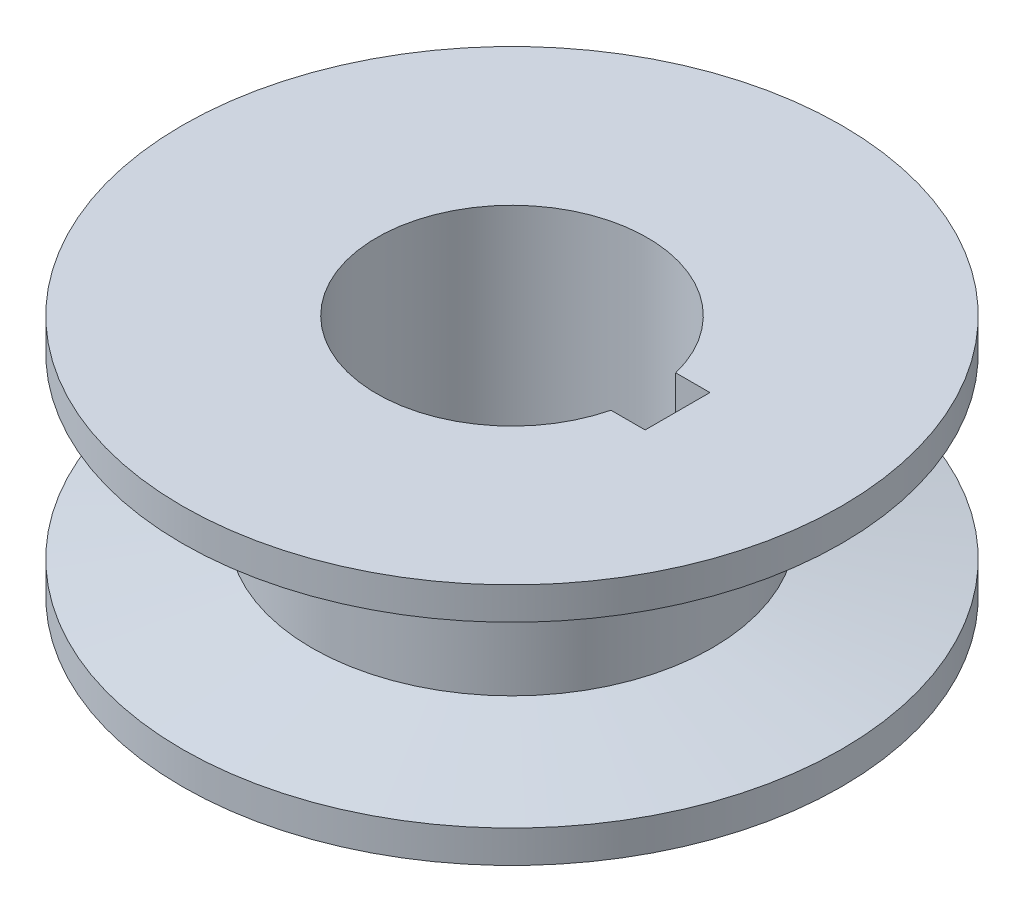
ISO-10303-21;
HEADER;
FILE_DESCRIPTION(('STEP AP214'),'2;1');
FILE_NAME('part.step','',(''),(''),'','','');
FILE_SCHEMA(('AUTOMOTIVE_DESIGN { 1 0 10303 214 1 1 1 1 }'));
ENDSEC;
DATA;
#1=APPLICATION_CONTEXT('core data for automotive mechanical design processes');
#2=APPLICATION_PROTOCOL_DEFINITION('international standard','automotive_design',2000,#1);
#3=PRODUCT_CONTEXT('',#1,'mechanical');
#4=PRODUCT('Part','Part','',(#3));
#5=PRODUCT_RELATED_PRODUCT_CATEGORY('part','',(#4));
#6=PRODUCT_DEFINITION_FORMATION('','',#4);
#7=PRODUCT_DEFINITION_CONTEXT('part definition',#1,'design');
#8=PRODUCT_DEFINITION('design','',#6,#7);
#9=PRODUCT_DEFINITION_SHAPE('','',#8);
#10=(LENGTH_UNIT() NAMED_UNIT(*) SI_UNIT(.MILLI.,.METRE.));
#11=(NAMED_UNIT(*) PLANE_ANGLE_UNIT() SI_UNIT($,.RADIAN.));
#12=(NAMED_UNIT(*) SI_UNIT($,.STERADIAN.) SOLID_ANGLE_UNIT());
#13=UNCERTAINTY_MEASURE_WITH_UNIT(LENGTH_MEASURE(1.E-05),#10,'distance_accuracy_value','');
#14=(GEOMETRIC_REPRESENTATION_CONTEXT(3) GLOBAL_UNCERTAINTY_ASSIGNED_CONTEXT((#13)) GLOBAL_UNIT_ASSIGNED_CONTEXT((#10,
#11,#12)) REPRESENTATION_CONTEXT('',''));
#15=CARTESIAN_POINT('',(0.,0.,0.));
#16=DIRECTION('',(0.,0.,1.));
#17=DIRECTION('',(1.,0.,0.));
#18=AXIS2_PLACEMENT_3D('',#15,#16,#17);
#19=CARTESIAN_POINT('',(3.49148133884313E-12,-1000.,0.));
#20=DIRECTION('',(0.,-1.,0.));
#21=DIRECTION('',(1.,0.,0.));
#22=AXIS2_PLACEMENT_3D('',#19,#20,#21);
#23=CYLINDRICAL_SURFACE('',#22,8.35);
#24=DIRECTION('',(0.,-1.,0.));
#25=VECTOR('',#24,1.);
#26=CARTESIAN_POINT('',(8.10694147012649,-1000.,-2.));
#27=LINE('',#26,#25);
#28=CARTESIAN_POINT('',(8.106941470123,7.49999999999998,-2.));
#29=VERTEX_POINT('',#28);
#30=CARTESIAN_POINT('',(8.106941470123,-7.50000000000002,-2.));
#31=VERTEX_POINT('',#30);
#32=EDGE_CURVE('E117',#29,#31,#27,.T.);
#33=ORIENTED_EDGE('',*,*,#32,.F.);
#34=CARTESIAN_POINT('',(0.,7.50000000000006,0.));
#35=DIRECTION('',(0.,-1.,0.));
#36=DIRECTION('',(1.,0.,0.));
#37=AXIS2_PLACEMENT_3D('',#34,#35,#36);
#38=CIRCLE('',#37,8.35000000000003);
#39=CARTESIAN_POINT('',(8.106941470123,7.49999999999998,2.));
#40=VERTEX_POINT('',#39);
#41=EDGE_CURVE('E100',#40,#29,#38,.T.);
#42=ORIENTED_EDGE('',*,*,#41,.F.);
#43=DIRECTION('',(0.,-1.,0.));
#44=VECTOR('',#43,1.);
#45=CARTESIAN_POINT('',(8.10694147012649,-1000.,2.));
#46=LINE('',#45,#44);
#47=CARTESIAN_POINT('',(8.106941470123,-7.50000000000002,2.));
#48=VERTEX_POINT('',#47);
#49=EDGE_CURVE('E86',#48,#40,#46,.F.);
#50=ORIENTED_EDGE('',*,*,#49,.F.);
#51=CARTESIAN_POINT('',(0.,-7.49999999999995,0.));
#52=DIRECTION('',(0.,-1.,0.));
#53=DIRECTION('',(1.,0.,0.));
#54=AXIS2_PLACEMENT_3D('',#51,#52,#53);
#55=CIRCLE('',#54,8.34999999999997);
#56=EDGE_CURVE('E49',#48,#31,#55,.T.);
#57=ORIENTED_EDGE('',*,*,#56,.T.);
#58=EDGE_LOOP('',(#33,#42,#50,#57));
#59=FACE_BOUND('',#58,.T.);
#60=ADVANCED_FACE('F41',(#59),#23,.F.);
#61=CARTESIAN_POINT('',(8.35,-7.50000000000002,0.));
#62=DIRECTION('',(0.,-1.,0.));
#63=DIRECTION('',(1.,0.,0.));
#64=AXIS2_PLACEMENT_3D('',#61,#62,#63);
#65=PLANE('',#64);
#66=DIRECTION('',(-1.,0.,0.));
#67=VECTOR('',#66,1.);
#68=CARTESIAN_POINT('',(10.216941,-7.50000000000001,-2.));
#69=LINE('',#68,#67);
#70=CARTESIAN_POINT('',(10.2169410000001,-7.50000000000001,-2.));
#71=VERTEX_POINT('',#70);
#72=EDGE_CURVE('E83',#71,#31,#69,.T.);
#73=ORIENTED_EDGE('',*,*,#72,.T.);
#74=ORIENTED_EDGE('',*,*,#56,.F.);
#75=DIRECTION('',(1.,0.,0.));
#76=VECTOR('',#75,1.);
#77=CARTESIAN_POINT('',(10.216941,-7.50000000000001,2.));
#78=LINE('',#77,#76);
#79=CARTESIAN_POINT('',(10.2169410000001,-7.50000000000001,2.));
#80=VERTEX_POINT('',#79);
#81=EDGE_CURVE('E105',#48,#80,#78,.T.);
#82=ORIENTED_EDGE('',*,*,#81,.T.);
#83=DIRECTION('',(0.,0.,-1.));
#84=VECTOR('',#83,1.);
#85=CARTESIAN_POINT('',(10.216941,-7.50000000000001,-2.));
#86=LINE('',#85,#84);
#87=EDGE_CURVE('E87',#80,#71,#86,.T.);
#88=ORIENTED_EDGE('',*,*,#87,.T.);
#89=EDGE_LOOP('',(#73,#74,#82,#88));
#90=FACE_BOUND('',#89,.T.);
#91=CARTESIAN_POINT('',(0.,-7.50000000000006,0.));
#92=DIRECTION('',(0.,-1.,0.));
#93=DIRECTION('',(1.,0.,0.));
#94=AXIS2_PLACEMENT_3D('',#91,#92,#93);
#95=CIRCLE('',#94,20.35);
#96=CARTESIAN_POINT('',(20.35,-7.49999999999999,0.));
#97=VERTEX_POINT('',#96);
#98=EDGE_CURVE('E142',#97,#97,#95,.T.);
#99=ORIENTED_EDGE('',*,*,#98,.T.);
#100=EDGE_LOOP('',(#99));
#101=FACE_BOUND('',#100,.T.);
#102=ADVANCED_FACE('F152',(#90,#101),#65,.T.);
#103=CARTESIAN_POINT('',(3.49148133884313E-12,-1000.,0.));
#104=DIRECTION('',(0.,-1.,0.));
#105=DIRECTION('',(1.,0.,0.));
#106=AXIS2_PLACEMENT_3D('',#103,#104,#105);
#107=CYLINDRICAL_SURFACE('',#106,20.35);
#108=CARTESIAN_POINT('',(0.,-5.50000000000006,0.));
#109=DIRECTION('',(0.,-1.,0.));
#110=DIRECTION('',(1.,0.,0.));
#111=AXIS2_PLACEMENT_3D('',#108,#109,#110);
#112=CIRCLE('',#111,20.35);
#113=CARTESIAN_POINT('',(20.35,-5.49999999999999,0.));
#114=VERTEX_POINT('',#113);
#115=EDGE_CURVE('E138',#114,#114,#112,.T.);
#116=ORIENTED_EDGE('',*,*,#115,.T.);
#117=EDGE_LOOP('',(#116));
#118=FACE_BOUND('',#117,.T.);
#119=ORIENTED_EDGE('',*,*,#98,.F.);
#120=EDGE_LOOP('',(#119));
#121=FACE_BOUND('',#120,.T.);
#122=ADVANCED_FACE('F168',(#118,#121),#107,.T.);
#123=CARTESIAN_POINT('',(0.,-5.50000000000006,0.));
#124=DIRECTION('',(0.,-1.,0.));
#125=DIRECTION('',(1.,0.,0.));
#126=AXIS2_PLACEMENT_3D('',#123,#124,#125);
#127=CONICAL_SURFACE('',#126,20.35,1.39626340159546);
#128=CARTESIAN_POINT('',(0.,-4.08938415433235,0.));
#129=DIRECTION('',(0.,-1.,0.));
#130=DIRECTION('',(1.,0.,0.));
#131=AXIS2_PLACEMENT_3D('',#128,#129,#130);
#132=CIRCLE('',#131,12.35);
#133=CARTESIAN_POINT('',(12.35,-4.08938415433231,0.));
#134=VERTEX_POINT('',#133);
#135=EDGE_CURVE('E134',#134,#134,#132,.T.);
#136=ORIENTED_EDGE('',*,*,#135,.T.);
#137=EDGE_LOOP('',(#136));
#138=FACE_BOUND('',#137,.T.);
#139=ORIENTED_EDGE('',*,*,#115,.F.);
#140=EDGE_LOOP('',(#139));
#141=FACE_BOUND('',#140,.T.);
#142=ADVANCED_FACE('F172',(#138,#141),#127,.T.);
#143=CARTESIAN_POINT('',(3.49148133884313E-12,-1000.,0.));
#144=DIRECTION('',(0.,-1.,0.));
#145=DIRECTION('',(1.,0.,0.));
#146=AXIS2_PLACEMENT_3D('',#143,#144,#145);
#147=CYLINDRICAL_SURFACE('',#146,12.35);
#148=CARTESIAN_POINT('',(0.,4.08938415433235,0.));
#149=DIRECTION('',(0.,-1.,0.));
#150=DIRECTION('',(1.,0.,0.));
#151=AXIS2_PLACEMENT_3D('',#148,#149,#150);
#152=CIRCLE('',#151,12.35);
#153=CARTESIAN_POINT('',(12.35,4.0893841543324,0.));
#154=VERTEX_POINT('',#153);
#155=EDGE_CURVE('E130',#154,#154,#152,.T.);
#156=ORIENTED_EDGE('',*,*,#155,.T.);
#157=EDGE_LOOP('',(#156));
#158=FACE_BOUND('',#157,.T.);
#159=ORIENTED_EDGE('',*,*,#135,.F.);
#160=EDGE_LOOP('',(#159));
#161=FACE_BOUND('',#160,.T.);
#162=ADVANCED_FACE('F178',(#158,#161),#147,.T.);
#163=CARTESIAN_POINT('',(0.,4.08938415433235,0.));
#164=DIRECTION('',(0.,1.,0.));
#165=DIRECTION('',(-1.,0.,0.));
#166=AXIS2_PLACEMENT_3D('',#163,#164,#165);
#167=CONICAL_SURFACE('',#166,12.35,1.39626340159547);
#168=CARTESIAN_POINT('',(0.,5.50000000000006,0.));
#169=DIRECTION('',(0.,-1.,0.));
#170=DIRECTION('',(1.,0.,0.));
#171=AXIS2_PLACEMENT_3D('',#168,#169,#170);
#172=CIRCLE('',#171,20.35);
#173=CARTESIAN_POINT('',(20.35,5.50000000000013,0.));
#174=VERTEX_POINT('',#173);
#175=EDGE_CURVE('E126',#174,#174,#172,.T.);
#176=ORIENTED_EDGE('',*,*,#175,.T.);
#177=EDGE_LOOP('',(#176));
#178=FACE_BOUND('',#177,.T.);
#179=ORIENTED_EDGE('',*,*,#155,.F.);
#180=EDGE_LOOP('',(#179));
#181=FACE_BOUND('',#180,.T.);
#182=ADVANCED_FACE('F182',(#178,#181),#167,.T.);
#183=CARTESIAN_POINT('',(3.49148133884313E-12,-1000.,0.));
#184=DIRECTION('',(0.,-1.,0.));
#185=DIRECTION('',(1.,0.,0.));
#186=AXIS2_PLACEMENT_3D('',#183,#184,#185);
#187=CYLINDRICAL_SURFACE('',#186,20.35);
#188=CARTESIAN_POINT('',(0.,7.50000000000006,0.));
#189=DIRECTION('',(0.,-1.,0.));
#190=DIRECTION('',(1.,0.,0.));
#191=AXIS2_PLACEMENT_3D('',#188,#189,#190);
#192=CIRCLE('',#191,20.35);
#193=CARTESIAN_POINT('',(20.35,7.50000000000013,0.));
#194=VERTEX_POINT('',#193);
#195=EDGE_CURVE('E122',#194,#194,#192,.T.);
#196=ORIENTED_EDGE('',*,*,#195,.T.);
#197=EDGE_LOOP('',(#196));
#198=FACE_BOUND('',#197,.T.);
#199=ORIENTED_EDGE('',*,*,#175,.F.);
#200=EDGE_LOOP('',(#199));
#201=FACE_BOUND('',#200,.T.);
#202=ADVANCED_FACE('F186',(#198,#201),#187,.T.);
#203=CARTESIAN_POINT('',(8.35,7.49999999999998,0.));
#204=DIRECTION('',(0.,1.,0.));
#205=DIRECTION('',(-1.,0.,0.));
#206=AXIS2_PLACEMENT_3D('',#203,#204,#205);
#207=PLANE('',#206);
#208=DIRECTION('',(-1.,0.,0.));
#209=VECTOR('',#208,1.);
#210=CARTESIAN_POINT('',(10.216941,7.49999999999998,-2.));
#211=LINE('',#210,#209);
#212=CARTESIAN_POINT('',(10.216941,7.49999999999998,-2.));
#213=VERTEX_POINT('',#212);
#214=EDGE_CURVE('E63',#213,#29,#211,.T.);
#215=ORIENTED_EDGE('',*,*,#214,.F.);
#216=DIRECTION('',(0.,0.,-1.));
#217=VECTOR('',#216,1.);
#218=CARTESIAN_POINT('',(10.216941,7.49999999999998,-2.));
#219=LINE('',#218,#217);
#220=CARTESIAN_POINT('',(10.216941,7.49999999999999,2.));
#221=VERTEX_POINT('',#220);
#222=EDGE_CURVE('E90',#221,#213,#219,.T.);
#223=ORIENTED_EDGE('',*,*,#222,.F.);
#224=DIRECTION('',(1.,0.,0.));
#225=VECTOR('',#224,1.);
#226=CARTESIAN_POINT('',(8.35,7.49999999999998,2.));
#227=LINE('',#226,#225);
#228=EDGE_CURVE('E11',#40,#221,#227,.T.);
#229=ORIENTED_EDGE('',*,*,#228,.F.);
#230=ORIENTED_EDGE('',*,*,#41,.T.);
#231=EDGE_LOOP('',(#215,#223,#229,#230));
#232=FACE_BOUND('',#231,.T.);
#233=ORIENTED_EDGE('',*,*,#195,.F.);
#234=EDGE_LOOP('',(#233));
#235=FACE_BOUND('',#234,.T.);
#236=ADVANCED_FACE('F97',(#232,#235),#207,.T.);
#237=CARTESIAN_POINT('',(10.2169410000001,-18.472050100026,-2.));
#238=DIRECTION('',(0.,0.,-1.));
#239=DIRECTION('',(-1.,0.,0.));
#240=AXIS2_PLACEMENT_3D('',#237,#238,#239);
#241=PLANE('',#240);
#242=ORIENTED_EDGE('',*,*,#32,.T.);
#243=ORIENTED_EDGE('',*,*,#72,.F.);
#244=DIRECTION('',(0.,1.,0.));
#245=VECTOR('',#244,1.);
#246=CARTESIAN_POINT('',(10.2169410000001,-18.472050100026,-2.));
#247=LINE('',#246,#245);
#248=EDGE_CURVE('E80',#71,#213,#247,.T.);
#249=ORIENTED_EDGE('',*,*,#248,.T.);
#250=ORIENTED_EDGE('',*,*,#214,.T.);
#251=EDGE_LOOP('',(#242,#243,#249,#250));
#252=FACE_BOUND('',#251,.T.);
#253=ADVANCED_FACE('F81',(#252),#241,.F.);
#254=CARTESIAN_POINT('',(10.2169410000001,-18.472050100026,2.));
#255=DIRECTION('',(0.,0.,1.));
#256=DIRECTION('',(1.,0.,0.));
#257=AXIS2_PLACEMENT_3D('',#254,#255,#256);
#258=PLANE('',#257);
#259=ORIENTED_EDGE('',*,*,#49,.T.);
#260=ORIENTED_EDGE('',*,*,#228,.T.);
#261=DIRECTION('',(0.,1.,0.));
#262=VECTOR('',#261,1.);
#263=CARTESIAN_POINT('',(10.2169410000001,-18.472050100026,2.));
#264=LINE('',#263,#262);
#265=EDGE_CURVE('E56',#80,#221,#264,.T.);
#266=ORIENTED_EDGE('',*,*,#265,.F.);
#267=ORIENTED_EDGE('',*,*,#81,.F.);
#268=EDGE_LOOP('',(#259,#260,#266,#267));
#269=FACE_BOUND('',#268,.T.);
#270=ADVANCED_FACE('F155',(#269),#258,.F.);
#271=CARTESIAN_POINT('',(10.2169410000001,-18.472050100026,-2.));
#272=DIRECTION('',(1.,0.,0.));
#273=DIRECTION('',(0.,1.,0.));
#274=AXIS2_PLACEMENT_3D('',#271,#272,#273);
#275=PLANE('',#274);
#276=ORIENTED_EDGE('',*,*,#265,.T.);
#277=ORIENTED_EDGE('',*,*,#222,.T.);
#278=ORIENTED_EDGE('',*,*,#248,.F.);
#279=ORIENTED_EDGE('',*,*,#87,.F.);
#280=EDGE_LOOP('',(#276,#277,#278,#279));
#281=FACE_BOUND('',#280,.T.);
#282=ADVANCED_FACE('F91',(#281),#275,.F.);
#283=CLOSED_SHELL('',(#60,#102,#122,#142,#162,#182,#202,#236,#253,#270,#282));
#284=MANIFOLD_SOLID_BREP('B2',#283);
#285=ADVANCED_BREP_SHAPE_REPRESENTATION('',(#18,#284),#14);
#286=SHAPE_DEFINITION_REPRESENTATION(#9,#285);
ENDSEC;
END-ISO-10303-21;
